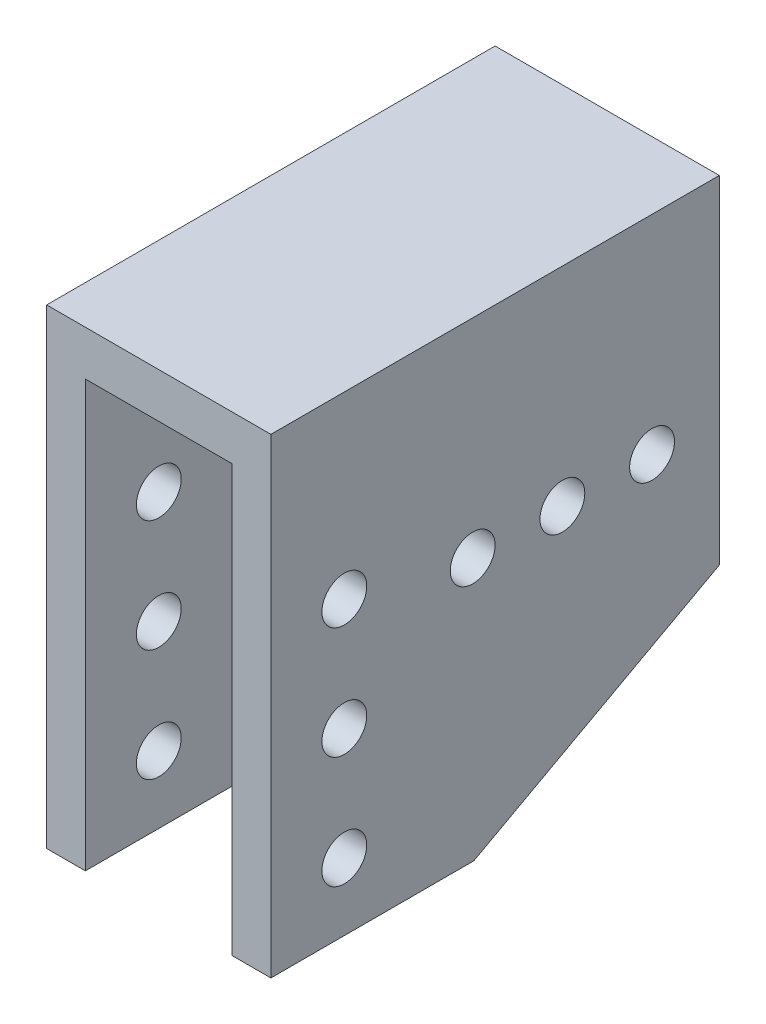
ISO-10303-21;
HEADER;
FILE_DESCRIPTION(('STEP AP214'),'2;1');
FILE_NAME('part.step','',(''),(''),'','','');
FILE_SCHEMA(('AUTOMOTIVE_DESIGN { 1 0 10303 214 1 1 1 1 }'));
ENDSEC;
DATA;
#1=APPLICATION_CONTEXT('core data for automotive mechanical design processes');
#2=APPLICATION_PROTOCOL_DEFINITION('international standard','automotive_design',2000,#1);
#3=PRODUCT_CONTEXT('',#1,'mechanical');
#4=PRODUCT('Part','Part','',(#3));
#5=PRODUCT_RELATED_PRODUCT_CATEGORY('part','',(#4));
#6=PRODUCT_DEFINITION_FORMATION('','',#4);
#7=PRODUCT_DEFINITION_CONTEXT('part definition',#1,'design');
#8=PRODUCT_DEFINITION('design','',#6,#7);
#9=PRODUCT_DEFINITION_SHAPE('','',#8);
#10=(LENGTH_UNIT() NAMED_UNIT(*) SI_UNIT(.MILLI.,.METRE.));
#11=(NAMED_UNIT(*) PLANE_ANGLE_UNIT() SI_UNIT($,.RADIAN.));
#12=(NAMED_UNIT(*) SI_UNIT($,.STERADIAN.) SOLID_ANGLE_UNIT());
#13=UNCERTAINTY_MEASURE_WITH_UNIT(LENGTH_MEASURE(1.E-05),#10,'distance_accuracy_value','');
#14=(GEOMETRIC_REPRESENTATION_CONTEXT(3) GLOBAL_UNCERTAINTY_ASSIGNED_CONTEXT((#13)) GLOBAL_UNIT_ASSIGNED_CONTEXT((#10,
#11,#12)) REPRESENTATION_CONTEXT('',''));
#15=CARTESIAN_POINT('',(0.,0.,0.));
#16=DIRECTION('',(0.,0.,1.));
#17=DIRECTION('',(1.,0.,0.));
#18=AXIS2_PLACEMENT_3D('',#15,#16,#17);
#19=CARTESIAN_POINT('',(0.,20.,0.));
#20=DIRECTION('',(1.,0.,0.));
#21=DIRECTION('',(0.,0.,-1.));
#22=AXIS2_PLACEMENT_3D('',#19,#20,#21);
#23=PLANE('',#22);
#24=CARTESIAN_POINT('',(0.,13.45,-18.));
#25=DIRECTION('',(1.,0.,0.));
#26=DIRECTION('',(0.,0.,-1.));
#27=AXIS2_PLACEMENT_3D('',#24,#25,#26);
#28=CIRCLE('',#27,2.);
#29=CARTESIAN_POINT('',(0.,13.45,-20.));
#30=VERTEX_POINT('',#29);
#31=EDGE_CURVE('E337',#30,#30,#28,.T.);
#32=ORIENTED_EDGE('',*,*,#31,.T.);
#33=EDGE_LOOP('',(#32));
#34=FACE_BOUND('',#33,.T.);
#35=CARTESIAN_POINT('',(0.,13.45,-34.));
#36=DIRECTION('',(1.,0.,0.));
#37=DIRECTION('',(0.,0.,-1.));
#38=AXIS2_PLACEMENT_3D('',#35,#36,#37);
#39=CIRCLE('',#38,2.);
#40=CARTESIAN_POINT('',(0.,13.45,-36.));
#41=VERTEX_POINT('',#40);
#42=EDGE_CURVE('E336',#41,#41,#39,.T.);
#43=ORIENTED_EDGE('',*,*,#42,.T.);
#44=EDGE_LOOP('',(#43));
#45=FACE_BOUND('',#44,.T.);
#46=CARTESIAN_POINT('',(0.,13.45,-26.));
#47=DIRECTION('',(1.,0.,0.));
#48=DIRECTION('',(0.,0.,-1.));
#49=AXIS2_PLACEMENT_3D('',#46,#47,#48);
#50=CIRCLE('',#49,2.);
#51=CARTESIAN_POINT('',(0.,13.45,-28.));
#52=VERTEX_POINT('',#51);
#53=EDGE_CURVE('E178',#52,#52,#50,.T.);
#54=ORIENTED_EDGE('',*,*,#53,.T.);
#55=EDGE_LOOP('',(#54));
#56=FACE_BOUND('',#55,.T.);
#57=CARTESIAN_POINT('',(0.,-4.,-6.55));
#58=DIRECTION('',(1.,0.,0.));
#59=DIRECTION('',(0.,0.,-1.));
#60=AXIS2_PLACEMENT_3D('',#57,#58,#59);
#61=CIRCLE('',#60,2.);
#62=CARTESIAN_POINT('',(0.,-4.,-8.55));
#63=VERTEX_POINT('',#62);
#64=EDGE_CURVE('E166',#63,#63,#61,.T.);
#65=ORIENTED_EDGE('',*,*,#64,.T.);
#66=EDGE_LOOP('',(#65));
#67=FACE_BOUND('',#66,.T.);
#68=CARTESIAN_POINT('',(0.,16.,-6.55));
#69=DIRECTION('',(1.,0.,0.));
#70=DIRECTION('',(0.,0.,-1.));
#71=AXIS2_PLACEMENT_3D('',#68,#69,#70);
#72=CIRCLE('',#71,2.);
#73=CARTESIAN_POINT('',(0.,16.,-8.55));
#74=VERTEX_POINT('',#73);
#75=EDGE_CURVE('E202',#74,#74,#72,.T.);
#76=ORIENTED_EDGE('',*,*,#75,.T.);
#77=EDGE_LOOP('',(#76));
#78=FACE_BOUND('',#77,.T.);
#79=CARTESIAN_POINT('',(0.,6.,-6.55));
#80=DIRECTION('',(1.,0.,0.));
#81=DIRECTION('',(0.,0.,-1.));
#82=AXIS2_PLACEMENT_3D('',#79,#80,#81);
#83=CIRCLE('',#82,2.);
#84=CARTESIAN_POINT('',(0.,6.,-8.55));
#85=VERTEX_POINT('',#84);
#86=EDGE_CURVE('E208',#85,#85,#83,.T.);
#87=ORIENTED_EDGE('',*,*,#86,.T.);
#88=EDGE_LOOP('',(#87));
#89=FACE_BOUND('',#88,.T.);
#90=DIRECTION('',(0.,-1.,0.));
#91=VECTOR('',#90,1.);
#92=CARTESIAN_POINT('',(0.,20.,-40.));
#93=LINE('',#92,#91);
#94=CARTESIAN_POINT('',(0.,32.,-40.));
#95=VERTEX_POINT('',#94);
#96=CARTESIAN_POINT('',(0.,1.9,-40.));
#97=VERTEX_POINT('',#96);
#98=EDGE_CURVE('E143',#95,#97,#93,.T.);
#99=ORIENTED_EDGE('',*,*,#98,.T.);
#100=DIRECTION('',(0.,-0.477445986309668,0.878661100855608));
#101=VECTOR('',#100,1.);
#102=CARTESIAN_POINT('',(0.,-15.3136425098999,-8.32111168346158));
#103=LINE('',#102,#101);
#104=CARTESIAN_POINT('',(0.,-10.,-18.1));
#105=VERTEX_POINT('',#104);
#106=EDGE_CURVE('E128',#97,#105,#103,.T.);
#107=ORIENTED_EDGE('',*,*,#106,.T.);
#108=DIRECTION('',(0.,0.,-1.));
#109=VECTOR('',#108,1.);
#110=CARTESIAN_POINT('',(0.,-10.,0.));
#111=LINE('',#110,#109);
#112=CARTESIAN_POINT('',(0.,-10.,0.));
#113=VERTEX_POINT('',#112);
#114=EDGE_CURVE('E260',#113,#105,#111,.T.);
#115=ORIENTED_EDGE('',*,*,#114,.F.);
#116=DIRECTION('',(0.,-1.,0.));
#117=VECTOR('',#116,1.);
#118=CARTESIAN_POINT('',(0.,20.,0.));
#119=LINE('',#118,#117);
#120=CARTESIAN_POINT('',(0.,32.,0.));
#121=VERTEX_POINT('',#120);
#122=EDGE_CURVE('E11',#121,#113,#119,.T.);
#123=ORIENTED_EDGE('',*,*,#122,.F.);
#124=DIRECTION('',(0.,0.,1.));
#125=VECTOR('',#124,1.);
#126=CARTESIAN_POINT('',(0.,32.,0.));
#127=LINE('',#126,#125);
#128=EDGE_CURVE('E149',#95,#121,#127,.T.);
#129=ORIENTED_EDGE('',*,*,#128,.F.);
#130=EDGE_LOOP('',(#99,#107,#115,#123,#129));
#131=FACE_BOUND('',#130,.T.);
#132=ADVANCED_FACE('F35',(#34,#45,#56,#67,#78,#89,#131),#23,.F.);
#133=CARTESIAN_POINT('',(0.,20.,0.));
#134=DIRECTION('',(0.,0.,-1.));
#135=DIRECTION('',(-1.,0.,0.));
#136=AXIS2_PLACEMENT_3D('',#133,#134,#135);
#137=PLANE('',#136);
#138=DIRECTION('',(-1.,0.,0.));
#139=VECTOR('',#138,1.);
#140=CARTESIAN_POINT('',(3.45,28.,0.));
#141=LINE('',#140,#139);
#142=CARTESIAN_POINT('',(16.55,28.,0.));
#143=VERTEX_POINT('',#142);
#144=CARTESIAN_POINT('',(3.45,28.,0.));
#145=VERTEX_POINT('',#144);
#146=EDGE_CURVE('E219',#143,#145,#141,.T.);
#147=ORIENTED_EDGE('',*,*,#146,.F.);
#148=DIRECTION('',(0.,1.,0.));
#149=VECTOR('',#148,1.);
#150=CARTESIAN_POINT('',(16.55,0.,0.));
#151=LINE('',#150,#149);
#152=CARTESIAN_POINT('',(16.55,-10.,0.));
#153=VERTEX_POINT('',#152);
#154=EDGE_CURVE('E290',#153,#143,#151,.T.);
#155=ORIENTED_EDGE('',*,*,#154,.F.);
#156=DIRECTION('',(-1.,0.,0.));
#157=VECTOR('',#156,1.);
#158=CARTESIAN_POINT('',(20.,-10.,0.));
#159=LINE('',#158,#157);
#160=CARTESIAN_POINT('',(20.,-10.,0.));
#161=VERTEX_POINT('',#160);
#162=EDGE_CURVE('E264',#161,#153,#159,.T.);
#163=ORIENTED_EDGE('',*,*,#162,.F.);
#164=DIRECTION('',(0.,-1.,0.));
#165=VECTOR('',#164,1.);
#166=CARTESIAN_POINT('',(20.,20.,0.));
#167=LINE('',#166,#165);
#168=CARTESIAN_POINT('',(20.,32.,0.));
#169=VERTEX_POINT('',#168);
#170=EDGE_CURVE('E43',#169,#161,#167,.T.);
#171=ORIENTED_EDGE('',*,*,#170,.F.);
#172=DIRECTION('',(1.,0.,0.));
#173=VECTOR('',#172,1.);
#174=CARTESIAN_POINT('',(0.,32.,0.));
#175=LINE('',#174,#173);
#176=EDGE_CURVE('E241',#121,#169,#175,.T.);
#177=ORIENTED_EDGE('',*,*,#176,.F.);
#178=ORIENTED_EDGE('',*,*,#122,.T.);
#179=DIRECTION('',(-1.,0.,0.));
#180=VECTOR('',#179,1.);
#181=CARTESIAN_POINT('',(3.45,-10.,0.));
#182=LINE('',#181,#180);
#183=CARTESIAN_POINT('',(3.45,-10.,0.));
#184=VERTEX_POINT('',#183);
#185=EDGE_CURVE('E257',#184,#113,#182,.T.);
#186=ORIENTED_EDGE('',*,*,#185,.F.);
#187=DIRECTION('',(0.,1.,0.));
#188=VECTOR('',#187,1.);
#189=CARTESIAN_POINT('',(3.45,0.,0.));
#190=LINE('',#189,#188);
#191=EDGE_CURVE('E157',#184,#145,#190,.T.);
#192=ORIENTED_EDGE('',*,*,#191,.T.);
#193=EDGE_LOOP('',(#147,#155,#163,#171,#177,#178,#186,#192));
#194=FACE_BOUND('',#193,.T.);
#195=ADVANCED_FACE('F297',(#194),#137,.F.);
#196=CARTESIAN_POINT('',(20.,20.,0.));
#197=DIRECTION('',(-1.,0.,0.));
#198=DIRECTION('',(0.,0.,1.));
#199=AXIS2_PLACEMENT_3D('',#196,#197,#198);
#200=PLANE('',#199);
#201=CARTESIAN_POINT('',(20.,13.45,-18.));
#202=DIRECTION('',(1.,0.,0.));
#203=DIRECTION('',(0.,0.,-1.));
#204=AXIS2_PLACEMENT_3D('',#201,#202,#203);
#205=CIRCLE('',#204,2.);
#206=CARTESIAN_POINT('',(20.,13.45,-20.));
#207=VERTEX_POINT('',#206);
#208=EDGE_CURVE('E331',#207,#207,#205,.T.);
#209=ORIENTED_EDGE('',*,*,#208,.F.);
#210=EDGE_LOOP('',(#209));
#211=FACE_BOUND('',#210,.T.);
#212=CARTESIAN_POINT('',(20.,13.45,-34.));
#213=DIRECTION('',(1.,0.,0.));
#214=DIRECTION('',(0.,0.,-1.));
#215=AXIS2_PLACEMENT_3D('',#212,#213,#214);
#216=CIRCLE('',#215,2.);
#217=CARTESIAN_POINT('',(20.,13.45,-36.));
#218=VERTEX_POINT('',#217);
#219=EDGE_CURVE('E333',#218,#218,#216,.T.);
#220=ORIENTED_EDGE('',*,*,#219,.F.);
#221=EDGE_LOOP('',(#220));
#222=FACE_BOUND('',#221,.T.);
#223=CARTESIAN_POINT('',(20.,13.45,-26.));
#224=DIRECTION('',(1.,0.,0.));
#225=DIRECTION('',(0.,0.,-1.));
#226=AXIS2_PLACEMENT_3D('',#223,#224,#225);
#227=CIRCLE('',#226,2.);
#228=CARTESIAN_POINT('',(20.,13.45,-28.));
#229=VERTEX_POINT('',#228);
#230=EDGE_CURVE('E340',#229,#229,#227,.T.);
#231=ORIENTED_EDGE('',*,*,#230,.F.);
#232=EDGE_LOOP('',(#231));
#233=FACE_BOUND('',#232,.T.);
#234=CARTESIAN_POINT('',(20.,-4.,-6.55));
#235=DIRECTION('',(1.,0.,0.));
#236=DIRECTION('',(0.,0.,-1.));
#237=AXIS2_PLACEMENT_3D('',#234,#235,#236);
#238=CIRCLE('',#237,2.);
#239=CARTESIAN_POINT('',(20.,-4.,-8.55));
#240=VERTEX_POINT('',#239);
#241=EDGE_CURVE('E199',#240,#240,#238,.T.);
#242=ORIENTED_EDGE('',*,*,#241,.F.);
#243=EDGE_LOOP('',(#242));
#244=FACE_BOUND('',#243,.T.);
#245=CARTESIAN_POINT('',(20.,16.,-6.55));
#246=DIRECTION('',(1.,0.,0.));
#247=DIRECTION('',(0.,0.,-1.));
#248=AXIS2_PLACEMENT_3D('',#245,#246,#247);
#249=CIRCLE('',#248,2.);
#250=CARTESIAN_POINT('',(20.,16.,-8.55));
#251=VERTEX_POINT('',#250);
#252=EDGE_CURVE('E205',#251,#251,#249,.T.);
#253=ORIENTED_EDGE('',*,*,#252,.F.);
#254=EDGE_LOOP('',(#253));
#255=FACE_BOUND('',#254,.T.);
#256=CARTESIAN_POINT('',(20.,6.,-6.55));
#257=DIRECTION('',(1.,0.,0.));
#258=DIRECTION('',(0.,0.,-1.));
#259=AXIS2_PLACEMENT_3D('',#256,#257,#258);
#260=CIRCLE('',#259,2.);
#261=CARTESIAN_POINT('',(20.,6.,-8.55));
#262=VERTEX_POINT('',#261);
#263=EDGE_CURVE('E196',#262,#262,#260,.T.);
#264=ORIENTED_EDGE('',*,*,#263,.F.);
#265=EDGE_LOOP('',(#264));
#266=FACE_BOUND('',#265,.T.);
#267=DIRECTION('',(0.,0.,1.));
#268=VECTOR('',#267,1.);
#269=CARTESIAN_POINT('',(20.,-10.,-40.));
#270=LINE('',#269,#268);
#271=CARTESIAN_POINT('',(20.,-10.,-18.1));
#272=VERTEX_POINT('',#271);
#273=EDGE_CURVE('E262',#272,#161,#270,.T.);
#274=ORIENTED_EDGE('',*,*,#273,.F.);
#275=DIRECTION('',(0.,-0.477445986309668,0.878661100855608));
#276=VECTOR('',#275,1.);
#277=CARTESIAN_POINT('',(20.,-15.3136425098999,-8.32111168346158));
#278=LINE('',#277,#276);
#279=CARTESIAN_POINT('',(20.,1.9,-40.));
#280=VERTEX_POINT('',#279);
#281=EDGE_CURVE('E51',#280,#272,#278,.T.);
#282=ORIENTED_EDGE('',*,*,#281,.F.);
#283=DIRECTION('',(0.,-1.,0.));
#284=VECTOR('',#283,1.);
#285=CARTESIAN_POINT('',(20.,20.,-40.));
#286=LINE('',#285,#284);
#287=CARTESIAN_POINT('',(20.,32.,-40.));
#288=VERTEX_POINT('',#287);
#289=EDGE_CURVE('E145',#288,#280,#286,.T.);
#290=ORIENTED_EDGE('',*,*,#289,.F.);
#291=DIRECTION('',(0.,0.,-1.));
#292=VECTOR('',#291,1.);
#293=CARTESIAN_POINT('',(20.,32.,0.));
#294=LINE('',#293,#292);
#295=EDGE_CURVE('E244',#169,#288,#294,.T.);
#296=ORIENTED_EDGE('',*,*,#295,.F.);
#297=ORIENTED_EDGE('',*,*,#170,.T.);
#298=EDGE_LOOP('',(#274,#282,#290,#296,#297));
#299=FACE_BOUND('',#298,.T.);
#300=ADVANCED_FACE('F328',(#211,#222,#233,#244,#255,#266,#299),#200,.F.);
#301=CARTESIAN_POINT('',(0.,20.,-40.));
#302=DIRECTION('',(0.,0.,1.));
#303=DIRECTION('',(1.,0.,0.));
#304=AXIS2_PLACEMENT_3D('',#301,#302,#303);
#305=PLANE('',#304);
#306=ORIENTED_EDGE('',*,*,#289,.T.);
#307=DIRECTION('',(1.,0.,0.));
#308=VECTOR('',#307,1.);
#309=CARTESIAN_POINT('',(0.,1.9,-40.));
#310=LINE('',#309,#308);
#311=EDGE_CURVE('E131',#97,#280,#310,.T.);
#312=ORIENTED_EDGE('',*,*,#311,.F.);
#313=ORIENTED_EDGE('',*,*,#98,.F.);
#314=DIRECTION('',(-1.,0.,0.));
#315=VECTOR('',#314,1.);
#316=CARTESIAN_POINT('',(0.,32.,-40.));
#317=LINE('',#316,#315);
#318=EDGE_CURVE('E247',#288,#95,#317,.T.);
#319=ORIENTED_EDGE('',*,*,#318,.F.);
#320=EDGE_LOOP('',(#306,#312,#313,#319));
#321=FACE_BOUND('',#320,.T.);
#322=DIRECTION('',(-1.,0.,0.));
#323=VECTOR('',#322,1.);
#324=CARTESIAN_POINT('',(0.,20.,-40.));
#325=LINE('',#324,#323);
#326=CARTESIAN_POINT('',(16.55,20.,-40.));
#327=VERTEX_POINT('',#326);
#328=CARTESIAN_POINT('',(3.45,20.,-40.));
#329=VERTEX_POINT('',#328);
#330=EDGE_CURVE('E228',#327,#329,#325,.T.);
#331=ORIENTED_EDGE('',*,*,#330,.T.);
#332=DIRECTION('',(0.,-1.,0.));
#333=VECTOR('',#332,1.);
#334=CARTESIAN_POINT('',(3.45,20.,-40.));
#335=LINE('',#334,#333);
#336=CARTESIAN_POINT('',(3.45000000000001,6.9,-40.));
#337=VERTEX_POINT('',#336);
#338=EDGE_CURVE('E270',#329,#337,#335,.T.);
#339=ORIENTED_EDGE('',*,*,#338,.T.);
#340=DIRECTION('',(1.,0.,0.));
#341=VECTOR('',#340,1.);
#342=CARTESIAN_POINT('',(3.45000000000001,6.9,-40.));
#343=LINE('',#342,#341);
#344=CARTESIAN_POINT('',(16.55,6.9,-40.));
#345=VERTEX_POINT('',#344);
#346=EDGE_CURVE('E273',#337,#345,#343,.T.);
#347=ORIENTED_EDGE('',*,*,#346,.T.);
#348=DIRECTION('',(0.,1.,0.));
#349=VECTOR('',#348,1.);
#350=CARTESIAN_POINT('',(16.55,20.,-40.));
#351=LINE('',#350,#349);
#352=EDGE_CURVE('E276',#345,#327,#351,.T.);
#353=ORIENTED_EDGE('',*,*,#352,.T.);
#354=EDGE_LOOP('',(#331,#339,#347,#353));
#355=FACE_BOUND('',#354,.T.);
#356=ADVANCED_FACE('F140',(#321,#355),#305,.F.);
#357=CARTESIAN_POINT('',(3.45,0.,-13.1));
#358=DIRECTION('',(-1.,0.,0.));
#359=DIRECTION('',(0.,0.,1.));
#360=AXIS2_PLACEMENT_3D('',#357,#358,#359);
#361=PLANE('',#360);
#362=CARTESIAN_POINT('',(3.45,13.45,-18.));
#363=DIRECTION('',(-1.,0.,0.));
#364=DIRECTION('',(0.,0.,1.));
#365=AXIS2_PLACEMENT_3D('',#362,#363,#364);
#366=CIRCLE('',#365,2.);
#367=CARTESIAN_POINT('',(3.45,13.45,-16.));
#368=VERTEX_POINT('',#367);
#369=EDGE_CURVE('E193',#368,#368,#366,.T.);
#370=ORIENTED_EDGE('',*,*,#369,.T.);
#371=EDGE_LOOP('',(#370));
#372=FACE_BOUND('',#371,.T.);
#373=CARTESIAN_POINT('',(3.45000000000001,13.45,-34.));
#374=DIRECTION('',(-1.,0.,0.));
#375=DIRECTION('',(0.,0.,1.));
#376=AXIS2_PLACEMENT_3D('',#373,#374,#375);
#377=CIRCLE('',#376,2.);
#378=CARTESIAN_POINT('',(3.45000000000001,13.45,-32.));
#379=VERTEX_POINT('',#378);
#380=EDGE_CURVE('E181',#379,#379,#377,.T.);
#381=ORIENTED_EDGE('',*,*,#380,.T.);
#382=EDGE_LOOP('',(#381));
#383=FACE_BOUND('',#382,.T.);
#384=CARTESIAN_POINT('',(3.45000000000001,13.45,-26.));
#385=DIRECTION('',(-1.,0.,0.));
#386=DIRECTION('',(0.,0.,1.));
#387=AXIS2_PLACEMENT_3D('',#384,#385,#386);
#388=CIRCLE('',#387,2.);
#389=CARTESIAN_POINT('',(3.45000000000001,13.45,-24.));
#390=VERTEX_POINT('',#389);
#391=EDGE_CURVE('E177',#390,#390,#388,.T.);
#392=ORIENTED_EDGE('',*,*,#391,.T.);
#393=EDGE_LOOP('',(#392));
#394=FACE_BOUND('',#393,.T.);
#395=CARTESIAN_POINT('',(3.45,-4.,-6.55));
#396=DIRECTION('',(-1.,0.,0.));
#397=DIRECTION('',(0.,0.,1.));
#398=AXIS2_PLACEMENT_3D('',#395,#396,#397);
#399=CIRCLE('',#398,2.);
#400=CARTESIAN_POINT('',(3.45,-4.,-4.55));
#401=VERTEX_POINT('',#400);
#402=EDGE_CURVE('E174',#401,#401,#399,.T.);
#403=ORIENTED_EDGE('',*,*,#402,.T.);
#404=EDGE_LOOP('',(#403));
#405=FACE_BOUND('',#404,.T.);
#406=CARTESIAN_POINT('',(3.45,16.,-6.55));
#407=DIRECTION('',(-1.,0.,0.));
#408=DIRECTION('',(0.,0.,1.));
#409=AXIS2_PLACEMENT_3D('',#406,#407,#408);
#410=CIRCLE('',#409,2.);
#411=CARTESIAN_POINT('',(3.45,16.,-4.55));
#412=VERTEX_POINT('',#411);
#413=EDGE_CURVE('E170',#412,#412,#410,.T.);
#414=ORIENTED_EDGE('',*,*,#413,.T.);
#415=EDGE_LOOP('',(#414));
#416=FACE_BOUND('',#415,.T.);
#417=CARTESIAN_POINT('',(3.45,6.,-6.55));
#418=DIRECTION('',(-1.,0.,0.));
#419=DIRECTION('',(0.,0.,1.));
#420=AXIS2_PLACEMENT_3D('',#417,#418,#419);
#421=CIRCLE('',#420,2.);
#422=CARTESIAN_POINT('',(3.45,6.,-4.55));
#423=VERTEX_POINT('',#422);
#424=EDGE_CURVE('E165',#423,#423,#421,.T.);
#425=ORIENTED_EDGE('',*,*,#424,.T.);
#426=EDGE_LOOP('',(#425));
#427=FACE_BOUND('',#426,.T.);
#428=DIRECTION('',(0.,0.,1.));
#429=VECTOR('',#428,1.);
#430=CARTESIAN_POINT('',(3.45,20.,-13.1));
#431=LINE('',#430,#429);
#432=CARTESIAN_POINT('',(3.45,20.,-13.1));
#433=VERTEX_POINT('',#432);
#434=EDGE_CURVE('E283',#329,#433,#431,.T.);
#435=ORIENTED_EDGE('',*,*,#434,.T.);
#436=DIRECTION('',(0.,-1.,0.));
#437=VECTOR('',#436,1.);
#438=CARTESIAN_POINT('',(3.45,20.,-13.1));
#439=LINE('',#438,#437);
#440=CARTESIAN_POINT('',(3.45,28.,-13.1));
#441=VERTEX_POINT('',#440);
#442=EDGE_CURVE('E226',#441,#433,#439,.T.);
#443=ORIENTED_EDGE('',*,*,#442,.F.);
#444=DIRECTION('',(0.,0.,1.));
#445=VECTOR('',#444,1.);
#446=CARTESIAN_POINT('',(3.45,28.,-28.4495928284759));
#447=LINE('',#446,#445);
#448=EDGE_CURVE('E229',#441,#145,#447,.T.);
#449=ORIENTED_EDGE('',*,*,#448,.T.);
#450=ORIENTED_EDGE('',*,*,#191,.F.);
#451=DIRECTION('',(0.,0.,1.));
#452=VECTOR('',#451,1.);
#453=CARTESIAN_POINT('',(3.45,-10.,-13.1));
#454=LINE('',#453,#452);
#455=CARTESIAN_POINT('',(3.45,-10.,-13.1));
#456=VERTEX_POINT('',#455);
#457=EDGE_CURVE('E254',#456,#184,#454,.T.);
#458=ORIENTED_EDGE('',*,*,#457,.F.);
#459=DIRECTION('',(0.,1.,0.));
#460=VECTOR('',#459,1.);
#461=CARTESIAN_POINT('',(3.45,0.,-13.1));
#462=LINE('',#461,#460);
#463=CARTESIAN_POINT('',(3.45000000000001,6.9,-13.1));
#464=VERTEX_POINT('',#463);
#465=EDGE_CURVE('E150',#456,#464,#462,.T.);
#466=ORIENTED_EDGE('',*,*,#465,.T.);
#467=DIRECTION('',(0.,0.,1.));
#468=VECTOR('',#467,1.);
#469=CARTESIAN_POINT('',(3.45000000000001,6.9,-40.));
#470=LINE('',#469,#468);
#471=EDGE_CURVE('E279',#337,#464,#470,.T.);
#472=ORIENTED_EDGE('',*,*,#471,.F.);
#473=ORIENTED_EDGE('',*,*,#338,.F.);
#474=EDGE_LOOP('',(#435,#443,#449,#450,#458,#466,#472,#473));
#475=FACE_BOUND('',#474,.T.);
#476=ADVANCED_FACE('F301',(#372,#383,#394,#405,#416,#427,#475),#361,.F.);
#477=CARTESIAN_POINT('',(16.55,0.,-13.1));
#478=DIRECTION('',(0.,0.,-1.));
#479=DIRECTION('',(-1.,0.,0.));
#480=AXIS2_PLACEMENT_3D('',#477,#478,#479);
#481=PLANE('',#480);
#482=DIRECTION('',(0.,1.,0.));
#483=VECTOR('',#482,1.);
#484=CARTESIAN_POINT('',(16.55,0.,-13.1));
#485=LINE('',#484,#483);
#486=CARTESIAN_POINT('',(16.55,-10.,-13.1));
#487=VERTEX_POINT('',#486);
#488=CARTESIAN_POINT('',(16.55,6.9,-13.1));
#489=VERTEX_POINT('',#488);
#490=EDGE_CURVE('E154',#487,#489,#485,.T.);
#491=ORIENTED_EDGE('',*,*,#490,.T.);
#492=DIRECTION('',(1.,0.,0.));
#493=VECTOR('',#492,1.);
#494=CARTESIAN_POINT('',(3.45000000000001,6.9,-13.1));
#495=LINE('',#494,#493);
#496=EDGE_CURVE('E59',#464,#489,#495,.T.);
#497=ORIENTED_EDGE('',*,*,#496,.F.);
#498=ORIENTED_EDGE('',*,*,#465,.F.);
#499=DIRECTION('',(-1.,0.,0.));
#500=VECTOR('',#499,1.);
#501=CARTESIAN_POINT('',(16.55,-10.,-13.1));
#502=LINE('',#501,#500);
#503=EDGE_CURVE('E249',#487,#456,#502,.T.);
#504=ORIENTED_EDGE('',*,*,#503,.F.);
#505=EDGE_LOOP('',(#491,#497,#498,#504));
#506=FACE_BOUND('',#505,.T.);
#507=ADVANCED_FACE('F317',(#506),#481,.F.);
#508=CARTESIAN_POINT('',(16.55,0.,-13.1));
#509=DIRECTION('',(1.,0.,0.));
#510=DIRECTION('',(0.,0.,-1.));
#511=AXIS2_PLACEMENT_3D('',#508,#509,#510);
#512=PLANE('',#511);
#513=CARTESIAN_POINT('',(16.55,13.45,-18.));
#514=DIRECTION('',(1.,0.,0.));
#515=DIRECTION('',(0.,0.,-1.));
#516=AXIS2_PLACEMENT_3D('',#513,#514,#515);
#517=CIRCLE('',#516,2.);
#518=CARTESIAN_POINT('',(16.55,13.45,-20.));
#519=VERTEX_POINT('',#518);
#520=EDGE_CURVE('E38',#519,#519,#517,.T.);
#521=ORIENTED_EDGE('',*,*,#520,.T.);
#522=EDGE_LOOP('',(#521));
#523=FACE_BOUND('',#522,.T.);
#524=CARTESIAN_POINT('',(16.55,13.45,-34.));
#525=DIRECTION('',(1.,0.,0.));
#526=DIRECTION('',(0.,0.,-1.));
#527=AXIS2_PLACEMENT_3D('',#524,#525,#526);
#528=CIRCLE('',#527,2.);
#529=CARTESIAN_POINT('',(16.55,13.45,-36.));
#530=VERTEX_POINT('',#529);
#531=EDGE_CURVE('E179',#530,#530,#528,.T.);
#532=ORIENTED_EDGE('',*,*,#531,.T.);
#533=EDGE_LOOP('',(#532));
#534=FACE_BOUND('',#533,.T.);
#535=CARTESIAN_POINT('',(16.55,13.45,-26.));
#536=DIRECTION('',(1.,0.,0.));
#537=DIRECTION('',(0.,0.,-1.));
#538=AXIS2_PLACEMENT_3D('',#535,#536,#537);
#539=CIRCLE('',#538,2.);
#540=CARTESIAN_POINT('',(16.55,13.45,-28.));
#541=VERTEX_POINT('',#540);
#542=EDGE_CURVE('E175',#541,#541,#539,.T.);
#543=ORIENTED_EDGE('',*,*,#542,.T.);
#544=EDGE_LOOP('',(#543));
#545=FACE_BOUND('',#544,.T.);
#546=CARTESIAN_POINT('',(16.55,-4.,-6.55));
#547=DIRECTION('',(1.,0.,0.));
#548=DIRECTION('',(0.,0.,-1.));
#549=AXIS2_PLACEMENT_3D('',#546,#547,#548);
#550=CIRCLE('',#549,2.);
#551=CARTESIAN_POINT('',(16.55,-4.,-8.55));
#552=VERTEX_POINT('',#551);
#553=EDGE_CURVE('E171',#552,#552,#550,.T.);
#554=ORIENTED_EDGE('',*,*,#553,.T.);
#555=EDGE_LOOP('',(#554));
#556=FACE_BOUND('',#555,.T.);
#557=CARTESIAN_POINT('',(16.55,16.,-6.55));
#558=DIRECTION('',(1.,0.,0.));
#559=DIRECTION('',(0.,0.,-1.));
#560=AXIS2_PLACEMENT_3D('',#557,#558,#559);
#561=CIRCLE('',#560,2.);
#562=CARTESIAN_POINT('',(16.55,16.,-8.55));
#563=VERTEX_POINT('',#562);
#564=EDGE_CURVE('E167',#563,#563,#561,.T.);
#565=ORIENTED_EDGE('',*,*,#564,.T.);
#566=EDGE_LOOP('',(#565));
#567=FACE_BOUND('',#566,.T.);
#568=CARTESIAN_POINT('',(16.55,6.,-6.55));
#569=DIRECTION('',(1.,0.,0.));
#570=DIRECTION('',(0.,0.,-1.));
#571=AXIS2_PLACEMENT_3D('',#568,#569,#570);
#572=CIRCLE('',#571,2.);
#573=CARTESIAN_POINT('',(16.55,6.,-8.55));
#574=VERTEX_POINT('',#573);
#575=EDGE_CURVE('E162',#574,#574,#572,.T.);
#576=ORIENTED_EDGE('',*,*,#575,.T.);
#577=EDGE_LOOP('',(#576));
#578=FACE_BOUND('',#577,.T.);
#579=ORIENTED_EDGE('',*,*,#154,.T.);
#580=DIRECTION('',(0.,0.,1.));
#581=VECTOR('',#580,1.);
#582=CARTESIAN_POINT('',(16.55,28.,-28.4495928284759));
#583=LINE('',#582,#581);
#584=CARTESIAN_POINT('',(16.55,28.,-13.1));
#585=VERTEX_POINT('',#584);
#586=EDGE_CURVE('E233',#585,#143,#583,.T.);
#587=ORIENTED_EDGE('',*,*,#586,.F.);
#588=DIRECTION('',(0.,1.,0.));
#589=VECTOR('',#588,1.);
#590=CARTESIAN_POINT('',(16.55,20.,-13.1));
#591=LINE('',#590,#589);
#592=CARTESIAN_POINT('',(16.55,20.,-13.1));
#593=VERTEX_POINT('',#592);
#594=EDGE_CURVE('E225',#593,#585,#591,.T.);
#595=ORIENTED_EDGE('',*,*,#594,.F.);
#596=DIRECTION('',(0.,0.,-1.));
#597=VECTOR('',#596,1.);
#598=CARTESIAN_POINT('',(16.55,20.,-13.1));
#599=LINE('',#598,#597);
#600=EDGE_CURVE('E287',#593,#327,#599,.T.);
#601=ORIENTED_EDGE('',*,*,#600,.T.);
#602=ORIENTED_EDGE('',*,*,#352,.F.);
#603=DIRECTION('',(0.,0.,1.));
#604=VECTOR('',#603,1.);
#605=CARTESIAN_POINT('',(16.55,6.9,-40.));
#606=LINE('',#605,#604);
#607=EDGE_CURVE('E281',#345,#489,#606,.T.);
#608=ORIENTED_EDGE('',*,*,#607,.T.);
#609=ORIENTED_EDGE('',*,*,#490,.F.);
#610=DIRECTION('',(0.,0.,-1.));
#611=VECTOR('',#610,1.);
#612=CARTESIAN_POINT('',(16.55,-10.,0.));
#613=LINE('',#612,#611);
#614=EDGE_CURVE('E267',#153,#487,#613,.T.);
#615=ORIENTED_EDGE('',*,*,#614,.F.);
#616=EDGE_LOOP('',(#579,#587,#595,#601,#602,#608,#609,#615));
#617=FACE_BOUND('',#616,.T.);
#618=ADVANCED_FACE('F304',(#523,#534,#545,#556,#567,#578,#617),#512,.F.);
#619=CARTESIAN_POINT('',(3.45000000000001,6.9,-40.));
#620=DIRECTION('',(0.,-1.,0.));
#621=DIRECTION('',(0.,0.,-1.));
#622=AXIS2_PLACEMENT_3D('',#619,#620,#621);
#623=PLANE('',#622);
#624=ORIENTED_EDGE('',*,*,#496,.T.);
#625=ORIENTED_EDGE('',*,*,#607,.F.);
#626=ORIENTED_EDGE('',*,*,#346,.F.);
#627=ORIENTED_EDGE('',*,*,#471,.T.);
#628=EDGE_LOOP('',(#624,#625,#626,#627));
#629=FACE_BOUND('',#628,.T.);
#630=ADVANCED_FACE('F315',(#629),#623,.F.);
#631=CARTESIAN_POINT('',(0.,-10.,0.));
#632=DIRECTION('',(0.,1.,0.));
#633=DIRECTION('',(0.,0.,1.));
#634=AXIS2_PLACEMENT_3D('',#631,#632,#633);
#635=PLANE('',#634);
#636=ORIENTED_EDGE('',*,*,#114,.T.);
#637=DIRECTION('',(1.,0.,0.));
#638=VECTOR('',#637,1.);
#639=CARTESIAN_POINT('',(0.,-10.,-18.1));
#640=LINE('',#639,#638);
#641=EDGE_CURVE('E132',#105,#272,#640,.T.);
#642=ORIENTED_EDGE('',*,*,#641,.T.);
#643=ORIENTED_EDGE('',*,*,#273,.T.);
#644=ORIENTED_EDGE('',*,*,#162,.T.);
#645=ORIENTED_EDGE('',*,*,#614,.T.);
#646=ORIENTED_EDGE('',*,*,#503,.T.);
#647=ORIENTED_EDGE('',*,*,#457,.T.);
#648=ORIENTED_EDGE('',*,*,#185,.T.);
#649=EDGE_LOOP('',(#636,#642,#643,#644,#645,#646,#647,#648));
#650=FACE_BOUND('',#649,.T.);
#651=ADVANCED_FACE('F320',(#650),#635,.F.);
#652=CARTESIAN_POINT('',(0.,20.,0.));
#653=DIRECTION('',(0.,-1.,0.));
#654=DIRECTION('',(0.,0.,-1.));
#655=AXIS2_PLACEMENT_3D('',#652,#653,#654);
#656=PLANE('',#655);
#657=DIRECTION('',(1.,0.,0.));
#658=VECTOR('',#657,1.);
#659=CARTESIAN_POINT('',(3.45,20.,-13.1));
#660=LINE('',#659,#658);
#661=EDGE_CURVE('E222',#433,#593,#660,.T.);
#662=ORIENTED_EDGE('',*,*,#661,.F.);
#663=ORIENTED_EDGE('',*,*,#434,.F.);
#664=ORIENTED_EDGE('',*,*,#330,.F.);
#665=ORIENTED_EDGE('',*,*,#600,.F.);
#666=EDGE_LOOP('',(#662,#663,#664,#665));
#667=FACE_BOUND('',#666,.T.);
#668=ADVANCED_FACE('F311',(#667),#656,.T.);
#669=CARTESIAN_POINT('',(0.,32.,0.));
#670=DIRECTION('',(0.,-1.,0.));
#671=DIRECTION('',(0.,0.,-1.));
#672=AXIS2_PLACEMENT_3D('',#669,#670,#671);
#673=PLANE('',#672);
#674=ORIENTED_EDGE('',*,*,#128,.T.);
#675=ORIENTED_EDGE('',*,*,#176,.T.);
#676=ORIENTED_EDGE('',*,*,#295,.T.);
#677=ORIENTED_EDGE('',*,*,#318,.T.);
#678=EDGE_LOOP('',(#674,#675,#676,#677));
#679=FACE_BOUND('',#678,.T.);
#680=ADVANCED_FACE('F327',(#679),#673,.F.);
#681=CARTESIAN_POINT('',(16.55,0.,-13.1));
#682=DIRECTION('',(0.,0.,-1.));
#683=DIRECTION('',(-1.,0.,0.));
#684=AXIS2_PLACEMENT_3D('',#681,#682,#683);
#685=PLANE('',#684);
#686=ORIENTED_EDGE('',*,*,#442,.T.);
#687=ORIENTED_EDGE('',*,*,#661,.T.);
#688=ORIENTED_EDGE('',*,*,#594,.T.);
#689=DIRECTION('',(-1.,0.,0.));
#690=VECTOR('',#689,1.);
#691=CARTESIAN_POINT('',(3.45,28.,-13.1));
#692=LINE('',#691,#690);
#693=EDGE_CURVE('E230',#585,#441,#692,.T.);
#694=ORIENTED_EDGE('',*,*,#693,.T.);
#695=EDGE_LOOP('',(#686,#687,#688,#694));
#696=FACE_BOUND('',#695,.T.);
#697=ADVANCED_FACE('F306',(#696),#685,.F.);
#698=CARTESIAN_POINT('',(3.45,28.,-28.4495928284759));
#699=DIRECTION('',(0.,1.,0.));
#700=DIRECTION('',(0.,0.,1.));
#701=AXIS2_PLACEMENT_3D('',#698,#699,#700);
#702=PLANE('',#701);
#703=ORIENTED_EDGE('',*,*,#586,.T.);
#704=ORIENTED_EDGE('',*,*,#146,.T.);
#705=ORIENTED_EDGE('',*,*,#448,.F.);
#706=ORIENTED_EDGE('',*,*,#693,.F.);
#707=EDGE_LOOP('',(#703,#704,#705,#706));
#708=FACE_BOUND('',#707,.T.);
#709=ADVANCED_FACE('F303',(#708),#702,.F.);
#710=CARTESIAN_POINT('',(0.,6.,-6.55));
#711=DIRECTION('',(1.,0.,0.));
#712=DIRECTION('',(0.,0.,-1.));
#713=AXIS2_PLACEMENT_3D('',#710,#711,#712);
#714=CYLINDRICAL_SURFACE('',#713,2.);
#715=ORIENTED_EDGE('',*,*,#263,.T.);
#716=EDGE_LOOP('',(#715));
#717=FACE_BOUND('',#716,.T.);
#718=ORIENTED_EDGE('',*,*,#575,.F.);
#719=EDGE_LOOP('',(#718));
#720=FACE_BOUND('',#719,.T.);
#721=ADVANCED_FACE('F401',(#717,#720),#714,.F.);
#722=CARTESIAN_POINT('',(0.,16.,-6.55));
#723=DIRECTION('',(1.,0.,0.));
#724=DIRECTION('',(0.,0.,-1.));
#725=AXIS2_PLACEMENT_3D('',#722,#723,#724);
#726=CYLINDRICAL_SURFACE('',#725,2.);
#727=ORIENTED_EDGE('',*,*,#252,.T.);
#728=EDGE_LOOP('',(#727));
#729=FACE_BOUND('',#728,.T.);
#730=ORIENTED_EDGE('',*,*,#564,.F.);
#731=EDGE_LOOP('',(#730));
#732=FACE_BOUND('',#731,.T.);
#733=ADVANCED_FACE('F408',(#729,#732),#726,.F.);
#734=CARTESIAN_POINT('',(0.,-4.,-6.55));
#735=DIRECTION('',(1.,0.,0.));
#736=DIRECTION('',(0.,0.,-1.));
#737=AXIS2_PLACEMENT_3D('',#734,#735,#736);
#738=CYLINDRICAL_SURFACE('',#737,2.);
#739=ORIENTED_EDGE('',*,*,#241,.T.);
#740=EDGE_LOOP('',(#739));
#741=FACE_BOUND('',#740,.T.);
#742=ORIENTED_EDGE('',*,*,#553,.F.);
#743=EDGE_LOOP('',(#742));
#744=FACE_BOUND('',#743,.T.);
#745=ADVANCED_FACE('F398',(#741,#744),#738,.F.);
#746=ORIENTED_EDGE('',*,*,#86,.F.);
#747=EDGE_LOOP('',(#746));
#748=FACE_BOUND('',#747,.T.);
#749=ORIENTED_EDGE('',*,*,#424,.F.);
#750=EDGE_LOOP('',(#749));
#751=FACE_BOUND('',#750,.T.);
#752=ADVANCED_FACE('F395',(#748,#751),#714,.F.);
#753=ORIENTED_EDGE('',*,*,#75,.F.);
#754=EDGE_LOOP('',(#753));
#755=FACE_BOUND('',#754,.T.);
#756=ORIENTED_EDGE('',*,*,#413,.F.);
#757=EDGE_LOOP('',(#756));
#758=FACE_BOUND('',#757,.T.);
#759=ADVANCED_FACE('F397',(#755,#758),#726,.F.);
#760=ORIENTED_EDGE('',*,*,#64,.F.);
#761=EDGE_LOOP('',(#760));
#762=FACE_BOUND('',#761,.T.);
#763=ORIENTED_EDGE('',*,*,#402,.F.);
#764=EDGE_LOOP('',(#763));
#765=FACE_BOUND('',#764,.T.);
#766=ADVANCED_FACE('F371',(#762,#765),#738,.F.);
#767=CARTESIAN_POINT('',(0.,13.45,-26.));
#768=DIRECTION('',(1.,0.,0.));
#769=DIRECTION('',(0.,0.,-1.));
#770=AXIS2_PLACEMENT_3D('',#767,#768,#769);
#771=CYLINDRICAL_SURFACE('',#770,2.);
#772=ORIENTED_EDGE('',*,*,#230,.T.);
#773=EDGE_LOOP('',(#772));
#774=FACE_BOUND('',#773,.T.);
#775=ORIENTED_EDGE('',*,*,#542,.F.);
#776=EDGE_LOOP('',(#775));
#777=FACE_BOUND('',#776,.T.);
#778=ADVANCED_FACE('F358',(#774,#777),#771,.F.);
#779=CARTESIAN_POINT('',(0.,13.45,-34.));
#780=DIRECTION('',(1.,0.,0.));
#781=DIRECTION('',(0.,0.,-1.));
#782=AXIS2_PLACEMENT_3D('',#779,#780,#781);
#783=CYLINDRICAL_SURFACE('',#782,2.);
#784=ORIENTED_EDGE('',*,*,#219,.T.);
#785=EDGE_LOOP('',(#784));
#786=FACE_BOUND('',#785,.T.);
#787=ORIENTED_EDGE('',*,*,#531,.F.);
#788=EDGE_LOOP('',(#787));
#789=FACE_BOUND('',#788,.T.);
#790=ADVANCED_FACE('F366',(#786,#789),#783,.F.);
#791=CARTESIAN_POINT('',(0.,13.45,-18.));
#792=DIRECTION('',(1.,0.,0.));
#793=DIRECTION('',(0.,0.,-1.));
#794=AXIS2_PLACEMENT_3D('',#791,#792,#793);
#795=CYLINDRICAL_SURFACE('',#794,2.);
#796=ORIENTED_EDGE('',*,*,#208,.T.);
#797=EDGE_LOOP('',(#796));
#798=FACE_BOUND('',#797,.T.);
#799=ORIENTED_EDGE('',*,*,#520,.F.);
#800=EDGE_LOOP('',(#799));
#801=FACE_BOUND('',#800,.T.);
#802=ADVANCED_FACE('F356',(#798,#801),#795,.F.);
#803=ORIENTED_EDGE('',*,*,#53,.F.);
#804=EDGE_LOOP('',(#803));
#805=FACE_BOUND('',#804,.T.);
#806=ORIENTED_EDGE('',*,*,#391,.F.);
#807=EDGE_LOOP('',(#806));
#808=FACE_BOUND('',#807,.T.);
#809=ADVANCED_FACE('F352',(#805,#808),#771,.F.);
#810=ORIENTED_EDGE('',*,*,#42,.F.);
#811=EDGE_LOOP('',(#810));
#812=FACE_BOUND('',#811,.T.);
#813=ORIENTED_EDGE('',*,*,#380,.F.);
#814=EDGE_LOOP('',(#813));
#815=FACE_BOUND('',#814,.T.);
#816=ADVANCED_FACE('F355',(#812,#815),#783,.F.);
#817=ORIENTED_EDGE('',*,*,#31,.F.);
#818=EDGE_LOOP('',(#817));
#819=FACE_BOUND('',#818,.T.);
#820=ORIENTED_EDGE('',*,*,#369,.F.);
#821=EDGE_LOOP('',(#820));
#822=FACE_BOUND('',#821,.T.);
#823=ADVANCED_FACE('F363',(#819,#822),#795,.F.);
#824=CARTESIAN_POINT('',(0.,-15.3136425098999,-8.32111168346158));
#825=DIRECTION('',(0.,0.878661100855608,0.477445986309668));
#826=DIRECTION('',(0.,-0.477445986309668,0.878661100855608));
#827=AXIS2_PLACEMENT_3D('',#824,#825,#826);
#828=PLANE('',#827);
#829=ORIENTED_EDGE('',*,*,#281,.T.);
#830=ORIENTED_EDGE('',*,*,#641,.F.);
#831=ORIENTED_EDGE('',*,*,#106,.F.);
#832=ORIENTED_EDGE('',*,*,#311,.T.);
#833=EDGE_LOOP('',(#829,#830,#831,#832));
#834=FACE_BOUND('',#833,.T.);
#835=ADVANCED_FACE('F130',(#834),#828,.F.);
#836=CLOSED_SHELL('',(#132,#195,#300,#356,#476,#507,#618,#630,#651,#668,#680,#697,#709,#721,
#733,#745,#752,#759,#766,#778,#790,#802,#809,#816,#823,#835));
#837=MANIFOLD_SOLID_BREP('B2',#836);
#838=ADVANCED_BREP_SHAPE_REPRESENTATION('',(#18,#837),#14);
#839=SHAPE_DEFINITION_REPRESENTATION(#9,#838);
ENDSEC;
END-ISO-10303-21;
